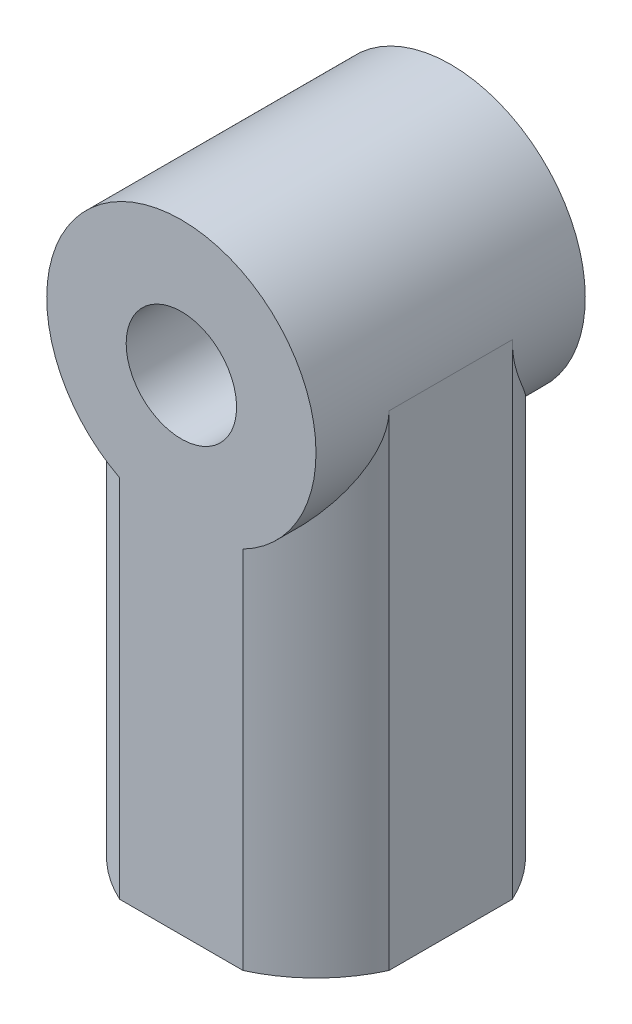
ISO-10303-21;
HEADER;
FILE_DESCRIPTION(('STEP AP214'),'2;1');
FILE_NAME('part.step','',(''),(''),'','','');
FILE_SCHEMA(('AUTOMOTIVE_DESIGN { 1 0 10303 214 1 1 1 1 }'));
ENDSEC;
DATA;
#1=APPLICATION_CONTEXT('core data for automotive mechanical design processes');
#2=APPLICATION_PROTOCOL_DEFINITION('international standard','automotive_design',2000,#1);
#3=PRODUCT_CONTEXT('',#1,'mechanical');
#4=PRODUCT('Part','Part','',(#3));
#5=PRODUCT_RELATED_PRODUCT_CATEGORY('part','',(#4));
#6=PRODUCT_DEFINITION_FORMATION('','',#4);
#7=PRODUCT_DEFINITION_CONTEXT('part definition',#1,'design');
#8=PRODUCT_DEFINITION('design','',#6,#7);
#9=PRODUCT_DEFINITION_SHAPE('','',#8);
#10=(LENGTH_UNIT() NAMED_UNIT(*) SI_UNIT(.MILLI.,.METRE.));
#11=(NAMED_UNIT(*) PLANE_ANGLE_UNIT() SI_UNIT($,.RADIAN.));
#12=(NAMED_UNIT(*) SI_UNIT($,.STERADIAN.) SOLID_ANGLE_UNIT());
#13=UNCERTAINTY_MEASURE_WITH_UNIT(LENGTH_MEASURE(1.E-05),#10,'distance_accuracy_value','');
#14=(GEOMETRIC_REPRESENTATION_CONTEXT(3) GLOBAL_UNCERTAINTY_ASSIGNED_CONTEXT((#13)) GLOBAL_UNIT_ASSIGNED_CONTEXT((#10,
#11,#12)) REPRESENTATION_CONTEXT('',''));
#15=CARTESIAN_POINT('',(0.,0.,0.));
#16=DIRECTION('',(0.,0.,1.));
#17=DIRECTION('',(1.,0.,0.));
#18=AXIS2_PLACEMENT_3D('',#15,#16,#17);
#19=CARTESIAN_POINT('',(504.503250066981,1441.12112005397,-8.0400000000008));
#20=DIRECTION('',(0.,-1.,0.));
#21=DIRECTION('',(0.,0.,1.));
#22=AXIS2_PLACEMENT_3D('',#19,#20,#21);
#23=PLANE('',#22);
#24=CARTESIAN_POINT('',(501.402450066981,1441.12112005397,-5.0000000000008));
#25=DIRECTION('',(0.,1.,0.));
#26=DIRECTION('',(0.,0.,1.));
#27=AXIS2_PLACEMENT_3D('',#24,#25,#26);
#28=CIRCLE('',#27,3.03999999999997);
#29=CARTESIAN_POINT('',(501.402450066981,1441.12112005397,-1.96000000000083));
#30=VERTEX_POINT('',#29);
#31=EDGE_CURVE('E19',#30,#30,#28,.T.);
#32=ORIENTED_EDGE('',*,*,#31,.F.);
#33=EDGE_LOOP('',(#32));
#34=FACE_BOUND('',#33,.T.);
#35=ADVANCED_FACE('F15',(#34),#23,.T.);
#36=CARTESIAN_POINT('',(501.402450066981,1428.12112005397,-5.0000000000008));
#37=DIRECTION('',(0.,1.,0.));
#38=DIRECTION('',(0.,0.,1.));
#39=AXIS2_PLACEMENT_3D('',#36,#37,#38);
#40=CYLINDRICAL_SURFACE('',#39,3.03999999999997);
#41=ORIENTED_EDGE('',*,*,#31,.T.);
#42=EDGE_LOOP('',(#41));
#43=FACE_BOUND('',#42,.T.);
#44=CARTESIAN_POINT('',(501.402450066981,1428.12112005397,-5.0000000000008));
#45=DIRECTION('',(0.,1.,0.));
#46=DIRECTION('',(0.,0.,1.));
#47=AXIS2_PLACEMENT_3D('',#44,#45,#46);
#48=CIRCLE('',#47,3.03999999999997);
#49=CARTESIAN_POINT('',(501.402450066981,1428.12112005397,-1.96000000000083));
#50=VERTEX_POINT('',#49);
#51=EDGE_CURVE('E129',#50,#50,#48,.T.);
#52=ORIENTED_EDGE('',*,*,#51,.F.);
#53=EDGE_LOOP('',(#52));
#54=FACE_BOUND('',#53,.T.);
#55=ADVANCED_FACE('F223',(#43,#54),#40,.F.);
#56=CARTESIAN_POINT('',(496.402450066981,1428.12112005397,-2.70871215252209));
#57=DIRECTION('',(-1.,0.,0.));
#58=DIRECTION('',(0.,1.,0.));
#59=AXIS2_PLACEMENT_3D('',#56,#57,#58);
#60=PLANE('',#59);
#61=DIRECTION('',(0.,1.,0.));
#62=VECTOR('',#61,1.);
#63=CARTESIAN_POINT('',(496.402450066981,1437.12112005397,-7.29128784747792));
#64=LINE('',#63,#62);
#65=CARTESIAN_POINT('',(496.402450066981,1428.12112005397,-7.29128784747799));
#66=VERTEX_POINT('',#65);
#67=CARTESIAN_POINT('',(496.402450066981,1446.12112005397,-7.29128784747792));
#68=VERTEX_POINT('',#67);
#69=EDGE_CURVE('E134',#66,#68,#64,.T.);
#70=ORIENTED_EDGE('',*,*,#69,.F.);
#71=DIRECTION('',(0.,0.,-1.));
#72=VECTOR('',#71,1.);
#73=CARTESIAN_POINT('',(496.402450066981,1428.12112005397,-4.99999999999998));
#74=LINE('',#73,#72);
#75=CARTESIAN_POINT('',(496.402450066981,1428.12112005397,-2.7087121525221));
#76=VERTEX_POINT('',#75);
#77=EDGE_CURVE('E89',#76,#66,#74,.T.);
#78=ORIENTED_EDGE('',*,*,#77,.F.);
#79=DIRECTION('',(0.,-1.,0.));
#80=VECTOR('',#79,1.);
#81=CARTESIAN_POINT('',(496.402450066981,1437.12112005397,-2.70871215252217));
#82=LINE('',#81,#80);
#83=CARTESIAN_POINT('',(496.402450066982,1446.12112005397,-2.70871215252033));
#84=VERTEX_POINT('',#83);
#85=EDGE_CURVE('E85',#84,#76,#82,.T.);
#86=ORIENTED_EDGE('',*,*,#85,.F.);
#87=DIRECTION('',(0.,0.,1.));
#88=VECTOR('',#87,1.);
#89=CARTESIAN_POINT('',(496.402450066981,1446.12112005397,-4.99999999999999));
#90=LINE('',#89,#88);
#91=EDGE_CURVE('E119',#68,#84,#90,.T.);
#92=ORIENTED_EDGE('',*,*,#91,.F.);
#93=EDGE_LOOP('',(#70,#78,#86,#92));
#94=FACE_BOUND('',#93,.T.);
#95=ADVANCED_FACE('F225',(#94),#60,.T.);
#96=CARTESIAN_POINT('',(506.402450066981,1446.12112005397,-2.70871215252208));
#97=DIRECTION('',(1.,0.,0.));
#98=DIRECTION('',(0.,-1.,0.));
#99=AXIS2_PLACEMENT_3D('',#96,#97,#98);
#100=PLANE('',#99);
#101=DIRECTION('',(0.,-1.,0.));
#102=VECTOR('',#101,1.);
#103=CARTESIAN_POINT('',(506.402450066981,1437.12112005397,-7.29128784747785));
#104=LINE('',#103,#102);
#105=CARTESIAN_POINT('',(506.40245006698,1446.12112005397,-7.29128784747471));
#106=VERTEX_POINT('',#105);
#107=CARTESIAN_POINT('',(506.402450066981,1428.12112005397,-7.29128784747787));
#108=VERTEX_POINT('',#107);
#109=EDGE_CURVE('E136',#106,#108,#104,.T.);
#110=ORIENTED_EDGE('',*,*,#109,.F.);
#111=DIRECTION('',(0.,0.,-1.));
#112=VECTOR('',#111,1.);
#113=CARTESIAN_POINT('',(506.402450066981,1446.12112005397,-4.99999999999999));
#114=LINE('',#113,#112);
#115=CARTESIAN_POINT('',(506.402450066981,1446.12112005397,-2.7087121525221));
#116=VERTEX_POINT('',#115);
#117=EDGE_CURVE('E116',#116,#106,#114,.T.);
#118=ORIENTED_EDGE('',*,*,#117,.F.);
#119=DIRECTION('',(0.,1.,0.));
#120=VECTOR('',#119,1.);
#121=CARTESIAN_POINT('',(506.402450066981,1437.12112005397,-2.70871215252208));
#122=LINE('',#121,#120);
#123=CARTESIAN_POINT('',(506.402450066981,1428.12112005397,-2.70871215252208));
#124=VERTEX_POINT('',#123);
#125=EDGE_CURVE('E124',#124,#116,#122,.T.);
#126=ORIENTED_EDGE('',*,*,#125,.F.);
#127=DIRECTION('',(0.,0.,1.));
#128=VECTOR('',#127,1.);
#129=CARTESIAN_POINT('',(506.402450066981,1428.12112005397,-4.99999999999998));
#130=LINE('',#129,#128);
#131=EDGE_CURVE('E127',#108,#124,#130,.T.);
#132=ORIENTED_EDGE('',*,*,#131,.F.);
#133=EDGE_LOOP('',(#110,#118,#126,#132));
#134=FACE_BOUND('',#133,.T.);
#135=ADVANCED_FACE('F216',(#134),#100,.T.);
#136=CARTESIAN_POINT('',(501.402450066982,1428.12112005397,-5.00000000000084));
#137=DIRECTION('',(-2.20657532238266E-13,1.,2.20657532238263E-13));
#138=DIRECTION('',(-1.,-2.20657532238266E-13,0.));
#139=AXIS2_PLACEMENT_3D('',#136,#137,#138);
#140=CYLINDRICAL_SURFACE('',#139,5.49999999999883);
#141=CARTESIAN_POINT('',(501.402450066982,1428.12112005397,-5.00000000000084));
#142=DIRECTION('',(-2.20657532238266E-13,1.,2.20657532238263E-13));
#143=DIRECTION('',(-1.,-2.20657532238266E-13,0.));
#144=AXIS2_PLACEMENT_3D('',#141,#142,#143);
#145=CIRCLE('',#144,5.49999999999883);
#146=CARTESIAN_POINT('',(503.693737914459,1428.12112005397,-10.));
#147=VERTEX_POINT('',#146);
#148=EDGE_CURVE('E130',#147,#108,#145,.F.);
#149=ORIENTED_EDGE('',*,*,#148,.F.);
#150=DIRECTION('',(0.,-1.,0.));
#151=VECTOR('',#150,1.);
#152=CARTESIAN_POINT('',(503.693737914459,1439.73612005397,-10.));
#153=LINE('',#152,#151);
#154=CARTESIAN_POINT('',(503.693737914459,1441.67702284531,-9.99999999999793));
#155=VERTEX_POINT('',#154);
#156=EDGE_CURVE('E113',#155,#147,#153,.T.);
#157=ORIENTED_EDGE('',*,*,#156,.F.);
#158=CARTESIAN_POINT('',(506.402450066978,1446.12112005397,-7.29128784747158));
#159=CARTESIAN_POINT('',(506.402468697578,1446.04737239063,-7.29121077630141));
#160=CARTESIAN_POINT('',(506.400819352999,1445.97367956106,-7.29484672692674));
#161=CARTESIAN_POINT('',(506.394340152049,1445.82729188328,-7.30892536257604));
#162=CARTESIAN_POINT('',(506.389519386904,1445.75459478697,-7.31934859025803));
#163=CARTESIAN_POINT('',(506.376958266668,1445.61187469429,-7.34616037488763));
#164=CARTESIAN_POINT('',(506.369268640232,1445.54182726788,-7.36244511880793));
#165=CARTESIAN_POINT('',(506.35116888539,1445.40344783088,-7.40012963012893));
#166=CARTESIAN_POINT('',(506.340756622325,1445.33511721263,-7.42153340993396));
#167=CARTESIAN_POINT('',(506.311480748449,1445.16609952037,-7.48051930944862));
#168=CARTESIAN_POINT('',(506.291012210973,1445.06663212876,-7.52079300825254));
#169=CARTESIAN_POINT('',(506.244944432601,1444.87201530233,-7.60819706869861));
#170=CARTESIAN_POINT('',(506.219342144332,1444.77686847351,-7.65533149826345));
#171=CARTESIAN_POINT('',(506.163186312313,1444.58977841845,-7.75475499860199));
#172=CARTESIAN_POINT('',(506.132593742133,1444.49786801476,-7.80708331084508));
#173=CARTESIAN_POINT('',(506.066856845711,1444.31765037017,-7.9150161111502));
#174=CARTESIAN_POINT('',(506.031710594477,1444.22934467398,-7.97062197929396));
#175=CARTESIAN_POINT('',(505.915150783507,1443.95878173141,-8.14740291832456));
#176=CARTESIAN_POINT('',(505.826035700066,1443.78216666815,-8.27220825085747));
#177=CARTESIAN_POINT('',(505.62866289902,1443.44200738349,-8.52345111060953));
#178=CARTESIAN_POINT('',(505.520443910038,1443.27843767177,-8.64988486471745));
#179=CARTESIAN_POINT('',(505.318842710787,1443.00964889779,-8.86351187812014));
#180=CARTESIAN_POINT('',(505.230327625619,1442.9013167739,-8.95140292736488));
#181=CARTESIAN_POINT('',(505.04324716819,1442.69119410428,-9.12441893969478));
#182=CARTESIAN_POINT('',(504.944678519678,1442.58940570875,-9.20954298907783));
#183=CARTESIAN_POINT('',(504.737542095672,1442.39318819134,-9.37547087406574));
#184=CARTESIAN_POINT('',(504.628992059144,1442.29874654401,-9.45628198548392));
#185=CARTESIAN_POINT('',(504.401680658591,1442.11791015131,-9.61233178650431));
#186=CARTESIAN_POINT('',(504.2829234471,1442.0315121631,-9.68757271922405));
#187=CARTESIAN_POINT('',(504.085115624638,1441.90079130264,-9.80214768448397));
#188=CARTESIAN_POINT('',(504.009307250794,1441.85352270776,-9.84375147750137));
#189=CARTESIAN_POINT('',(503.854160326853,1441.76254238298,-9.92409861459814));
#190=CARTESIAN_POINT('',(503.774822723517,1441.71882970796,-9.96284271849717));
#191=CARTESIAN_POINT('',(503.693737914458,1441.67702284531,-9.99999999999586));
#192=B_SPLINE_CURVE_WITH_KNOTS('',3,(#158,#159,#160,#161,#162,#163,#164,#165,#166,#167,#168,
#169,#170,#171,#172,#173,#174,#175,#176,#177,#178,#179,#180,#181,#182,#183,#184,#185,#186,#187,
#188,#189,#190,#191),.UNSPECIFIED.,.F.,.F.,(4,2,2,2,2,2,2,2,2,2,2,2,2,2,2,2,4),(0.,
0.221047456300763,0.441464000877186,0.658154738830127,0.875015883262775,1.20217741665796,
1.52953372966638,1.85958503171686,2.18977631540538,2.89009080085787,3.58900153658855,
4.08423143431468,4.57962323605405,5.07415104144705,5.56847860423153,5.86397442257535,
6.15939144289103),.UNSPECIFIED.);
#193=EDGE_CURVE('E125',#106,#155,#192,.T.);
#194=ORIENTED_EDGE('',*,*,#193,.F.);
#195=ORIENTED_EDGE('',*,*,#109,.T.);
#196=EDGE_LOOP('',(#149,#157,#194,#195));
#197=FACE_BOUND('',#196,.T.);
#198=ADVANCED_FACE('F180',(#197),#140,.T.);
#199=CARTESIAN_POINT('',(501.40245006698,1428.12112005397,-5.00000000000051));
#200=DIRECTION('',(2.20657532238293E-13,1.,2.2065753223829E-13));
#201=DIRECTION('',(-1.,2.20657532238293E-13,0.));
#202=AXIS2_PLACEMENT_3D('',#199,#200,#201);
#203=CYLINDRICAL_SURFACE('',#202,5.4999999999992);
#204=ORIENTED_EDGE('',*,*,#69,.T.);
#205=CARTESIAN_POINT('',(499.111162219503,1441.67702284531,-9.99999999999573));
#206=CARTESIAN_POINT('',(498.974468190255,1441.74750945246,-9.93736607777522));
#207=CARTESIAN_POINT('',(498.842783217536,1441.82337477373,-9.87023359335496));
#208=CARTESIAN_POINT('',(498.589762153638,1441.98454234416,-9.72861031659635));
#209=CARTESIAN_POINT('',(498.468414477741,1442.06983377667,-9.6541279686793));
#210=CARTESIAN_POINT('',(498.237255671421,1442.24779936122,-9.50007299344089));
#211=CARTESIAN_POINT('',(498.12734079163,1442.34039063878,-9.42055909232237));
#212=CARTESIAN_POINT('',(497.917589858555,1442.5328052584,-9.25716022691396));
#213=CARTESIAN_POINT('',(497.817752761025,1442.63262784933,-9.17327571686899));
#214=CARTESIAN_POINT('',(497.665963082926,1442.79760799686,-9.03664887659868));
#215=CARTESIAN_POINT('',(497.610826626502,1442.86066561165,-8.98486669258668));
#216=CARTESIAN_POINT('',(497.50402425365,1442.98914596866,-8.88044591925046));
#217=CARTESIAN_POINT('',(497.452362458194,1443.05457138249,-8.82780640188902));
#218=CARTESIAN_POINT('',(497.320677889379,1443.2301476852,-8.6882681178072));
#219=CARTESIAN_POINT('',(497.243601241013,1443.3421902223,-8.6009488937272));
#220=CARTESIAN_POINT('',(497.098702263217,1443.57234322171,-8.42645875660542));
#221=CARTESIAN_POINT('',(497.030885819876,1443.69045747838,-8.33928797235541));
#222=CARTESIAN_POINT('',(496.904449416125,1443.93325271203,-8.1669258659109));
#223=CARTESIAN_POINT('',(496.845844365261,1444.05794390758,-8.08173793918609));
#224=CARTESIAN_POINT('',(496.738212640452,1444.31440576127,-7.91626606516775));
#225=CARTESIAN_POINT('',(496.689177738745,1444.44617021291,-7.83597794653973));
#226=CARTESIAN_POINT('',(496.600911030214,1444.71899889171,-7.68383769455685));
#227=CARTESIAN_POINT('',(496.561746775976,1444.86011927508,-7.6120453870023));
#228=CARTESIAN_POINT('',(496.49516410914,1445.15126723172,-7.48468942177348));
#229=CARTESIAN_POINT('',(496.467661853702,1445.30122208031,-7.42901086908798));
#230=CARTESIAN_POINT('',(496.432561751696,1445.56271406802,-7.35612909572468));
#231=CARTESIAN_POINT('',(496.42144331092,1445.67187649561,-7.33235876027965));
#232=CARTESIAN_POINT('',(496.410138426183,1445.83831691159,-7.30800819989283));
#233=CARTESIAN_POINT('',(496.407264855342,1445.89460968377,-7.30177275851153));
#234=CARTESIAN_POINT('',(496.40341687583,1446.00763255661,-7.29339845561816));
#235=CARTESIAN_POINT('',(496.40244485943,1446.06436311812,-7.29126475440413));
#236=CARTESIAN_POINT('',(496.402450066983,1446.12112005397,-7.291287847469));
#237=B_SPLINE_CURVE_WITH_KNOTS('',3,(#205,#206,#207,#208,#209,#210,#211,#212,#213,#214,#215,
#216,#217,#218,#219,#220,#221,#222,#223,#224,#225,#226,#227,#228,#229,#230,#231,#232,#233,#234,
#235,#236),.UNSPECIFIED.,.F.,.F.,(4,2,2,2,2,2,2,2,2,2,2,2,2,2,2,4),(0.,0.497757796408778,
0.994950222848642,1.48714239439911,1.9792835132156,2.27462982671487,2.57032046158763,
3.05475461756806,3.53949527632509,4.02501263040184,4.51011071298042,4.9984436776764,
5.48320371496026,5.81881909041372,5.98878110264245,6.15895680030446),.UNSPECIFIED.);
#238=CARTESIAN_POINT('',(499.111162219503,1441.67702284531,-9.99999999999787));
#239=VERTEX_POINT('',#238);
#240=EDGE_CURVE('E123',#239,#68,#237,.T.);
#241=ORIENTED_EDGE('',*,*,#240,.F.);
#242=DIRECTION('',(0.,1.,0.));
#243=VECTOR('',#242,1.);
#244=CARTESIAN_POINT('',(499.111162219503,1439.73612005397,-10.));
#245=LINE('',#244,#243);
#246=CARTESIAN_POINT('',(499.111162219503,1428.12112005397,-10.));
#247=VERTEX_POINT('',#246);
#248=EDGE_CURVE('E106',#247,#239,#245,.T.);
#249=ORIENTED_EDGE('',*,*,#248,.F.);
#250=CARTESIAN_POINT('',(501.40245006698,1428.12112005397,-5.00000000000051));
#251=DIRECTION('',(2.20657532238293E-13,1.,2.2065753223829E-13));
#252=DIRECTION('',(-1.,2.20657532238293E-13,0.));
#253=AXIS2_PLACEMENT_3D('',#250,#251,#252);
#254=CIRCLE('',#253,5.4999999999992);
#255=EDGE_CURVE('E132',#66,#247,#254,.F.);
#256=ORIENTED_EDGE('',*,*,#255,.F.);
#257=EDGE_LOOP('',(#204,#241,#249,#256));
#258=FACE_BOUND('',#257,.T.);
#259=ADVANCED_FACE('F177',(#258),#203,.T.);
#260=CARTESIAN_POINT('',(501.40245006698,1428.12112005397,-4.99999999999965));
#261=DIRECTION('',(0.,1.,0.));
#262=DIRECTION('',(0.,0.,1.));
#263=AXIS2_PLACEMENT_3D('',#260,#261,#262);
#264=CYLINDRICAL_SURFACE('',#263,5.49999999999943);
#265=CARTESIAN_POINT('',(501.40245006698,1428.12112005397,-4.99999999999965));
#266=DIRECTION('',(0.,1.,0.));
#267=DIRECTION('',(0.,0.,1.));
#268=AXIS2_PLACEMENT_3D('',#265,#266,#267);
#269=CIRCLE('',#268,5.49999999999943);
#270=CARTESIAN_POINT('',(499.111162219503,1428.12112005397,0.));
#271=VERTEX_POINT('',#270);
#272=EDGE_CURVE('E78',#271,#76,#269,.F.);
#273=ORIENTED_EDGE('',*,*,#272,.F.);
#274=DIRECTION('',(0.,-1.,0.));
#275=VECTOR('',#274,1.);
#276=CARTESIAN_POINT('',(499.111162219503,1439.73612005397,0.));
#277=LINE('',#276,#275);
#278=CARTESIAN_POINT('',(499.111162219502,1441.67702284531,-2.66675482783348E-13));
#279=VERTEX_POINT('',#278);
#280=EDGE_CURVE('E82',#279,#271,#277,.T.);
#281=ORIENTED_EDGE('',*,*,#280,.F.);
#282=CARTESIAN_POINT('',(496.402450066983,1446.12112005397,-2.70871215251849));
#283=CARTESIAN_POINT('',(496.402431436383,1446.04737239063,-2.70878922368871));
#284=CARTESIAN_POINT('',(496.404080780962,1445.97367956106,-2.70515327306344));
#285=CARTESIAN_POINT('',(496.410559981911,1445.82729188328,-2.69107463741426));
#286=CARTESIAN_POINT('',(496.415380747056,1445.75459478697,-2.68065140973232));
#287=CARTESIAN_POINT('',(496.427941867293,1445.61187469429,-2.65383962510286));
#288=CARTESIAN_POINT('',(496.435631493729,1445.54182726788,-2.63755488118262));
#289=CARTESIAN_POINT('',(496.453731248571,1445.40344783088,-2.59987036986173));
#290=CARTESIAN_POINT('',(496.464143511636,1445.33511721262,-2.57846659005674));
#291=CARTESIAN_POINT('',(496.493419385512,1445.16609952037,-2.51948069054219));
#292=CARTESIAN_POINT('',(496.513887922988,1445.06663212876,-2.47920699173838));
#293=CARTESIAN_POINT('',(496.55995570136,1444.87201530233,-2.39180293129253));
#294=CARTESIAN_POINT('',(496.585557989629,1444.77686847351,-2.34466850172784));
#295=CARTESIAN_POINT('',(496.641713821648,1444.58977841845,-2.24524500138958));
#296=CARTESIAN_POINT('',(496.672306391828,1444.49786801475,-2.19291668914662));
#297=CARTESIAN_POINT('',(496.73804328825,1444.31765037017,-2.0849838888417));
#298=CARTESIAN_POINT('',(496.773189539484,1444.22934467398,-2.02937802069802));
#299=CARTESIAN_POINT('',(496.889749350454,1443.95878173141,-1.85259708166814));
#300=CARTESIAN_POINT('',(496.978864433895,1443.78216666815,-1.72779174913584));
#301=CARTESIAN_POINT('',(497.17623723494,1443.44200738349,-1.47654888938508));
#302=CARTESIAN_POINT('',(497.284456223922,1443.27843767177,-1.35011513527784));
#303=CARTESIAN_POINT('',(497.486057423173,1443.00964889779,-1.13648812187593));
#304=CARTESIAN_POINT('',(497.57457250834,1442.9013167739,-1.04859707263127));
#305=CARTESIAN_POINT('',(497.76165296577,1442.69119410428,-0.87558106030155));
#306=CARTESIAN_POINT('',(497.860221614281,1442.58940570875,-0.790457010918578));
#307=CARTESIAN_POINT('',(498.067358038287,1442.39318819134,-0.62452912593084));
#308=CARTESIAN_POINT('',(498.175908074815,1442.29874654401,-0.543718014512741));
#309=CARTESIAN_POINT('',(498.403219475368,1442.11791015131,-0.387668213492474));
#310=CARTESIAN_POINT('',(498.521976686859,1442.0315121631,-0.31242728077278));
#311=CARTESIAN_POINT('',(498.719784509321,1441.90079130264,-0.197852315512842));
#312=CARTESIAN_POINT('',(498.795592883166,1441.85352270776,-0.156248522495378));
#313=CARTESIAN_POINT('',(498.950739807107,1441.76254238298,-0.0759013853984586));
#314=CARTESIAN_POINT('',(499.030077410443,1441.71882970796,-0.0371572814993422));
#315=CARTESIAN_POINT('',(499.111162219502,1441.67702284531,-5.49631685798588E-13));
#316=B_SPLINE_CURVE_WITH_KNOTS('',3,(#282,#283,#284,#285,#286,#287,#288,#289,#290,#291,#292,
#293,#294,#295,#296,#297,#298,#299,#300,#301,#302,#303,#304,#305,#306,#307,#308,#309,#310,#311,
#312,#313,#314,#315),.UNSPECIFIED.,.F.,.F.,(4,2,2,2,2,2,2,2,2,2,2,2,2,2,2,2,4),(0.,
0.221047456300975,0.441464000877596,0.65815473883072,0.875015883263771,1.20217741665907,
1.52953372966734,1.85958503171742,2.18977631540629,2.89009080085634,3.58900153658407,
4.0842314343104,4.57962323604951,5.07415104144246,5.56847860422678,5.86397442257134,
6.1593914428879),.UNSPECIFIED.);
#317=EDGE_CURVE('E122',#84,#279,#316,.T.);
#318=ORIENTED_EDGE('',*,*,#317,.F.);
#319=ORIENTED_EDGE('',*,*,#85,.T.);
#320=EDGE_LOOP('',(#273,#281,#318,#319));
#321=FACE_BOUND('',#320,.T.);
#322=ADVANCED_FACE('F80',(#321),#264,.T.);
#323=CARTESIAN_POINT('',(506.402450066981,1428.12112005397,0.));
#324=DIRECTION('',(0.,-1.,0.));
#325=DIRECTION('',(-1.,0.,0.));
#326=AXIS2_PLACEMENT_3D('',#323,#324,#325);
#327=PLANE('',#326);
#328=ORIENTED_EDGE('',*,*,#51,.T.);
#329=EDGE_LOOP('',(#328));
#330=FACE_BOUND('',#329,.T.);
#331=ORIENTED_EDGE('',*,*,#148,.T.);
#332=ORIENTED_EDGE('',*,*,#131,.T.);
#333=CARTESIAN_POINT('',(501.402450066982,1428.12112005397,-4.9999999999991));
#334=DIRECTION('',(0.,1.,0.));
#335=DIRECTION('',(0.,0.,1.));
#336=AXIS2_PLACEMENT_3D('',#333,#334,#335);
#337=CIRCLE('',#336,5.49999999999882);
#338=CARTESIAN_POINT('',(503.693737914459,1428.12112005397,0.));
#339=VERTEX_POINT('',#338);
#340=EDGE_CURVE('E95',#339,#124,#337,.T.);
#341=ORIENTED_EDGE('',*,*,#340,.F.);
#342=DIRECTION('',(1.,0.,0.));
#343=VECTOR('',#342,1.);
#344=CARTESIAN_POINT('',(501.40245006698,1428.12112005397,0.));
#345=LINE('',#344,#343);
#346=EDGE_CURVE('E91',#271,#339,#345,.T.);
#347=ORIENTED_EDGE('',*,*,#346,.F.);
#348=ORIENTED_EDGE('',*,*,#272,.T.);
#349=ORIENTED_EDGE('',*,*,#77,.T.);
#350=ORIENTED_EDGE('',*,*,#255,.T.);
#351=DIRECTION('',(-1.,0.,0.));
#352=VECTOR('',#351,1.);
#353=CARTESIAN_POINT('',(501.402450066981,1428.12112005397,-10.));
#354=LINE('',#353,#352);
#355=EDGE_CURVE('E112',#147,#247,#354,.T.);
#356=ORIENTED_EDGE('',*,*,#355,.F.);
#357=EDGE_LOOP('',(#331,#332,#341,#347,#348,#349,#350,#356));
#358=FACE_BOUND('',#357,.T.);
#359=ADVANCED_FACE('F93',(#330,#358),#327,.T.);
#360=CARTESIAN_POINT('',(501.402450066982,1428.12112005397,-4.9999999999991));
#361=DIRECTION('',(0.,1.,0.));
#362=DIRECTION('',(0.,0.,1.));
#363=AXIS2_PLACEMENT_3D('',#360,#361,#362);
#364=CYLINDRICAL_SURFACE('',#363,5.49999999999882);
#365=ORIENTED_EDGE('',*,*,#125,.T.);
#366=CARTESIAN_POINT('',(503.69373791446,1441.67702284531,-3.54547411338768E-13));
#367=CARTESIAN_POINT('',(503.830431943708,1441.74750945246,-0.0626339222207645));
#368=CARTESIAN_POINT('',(503.962116916427,1441.82337477373,-0.129766406640923));
#369=CARTESIAN_POINT('',(504.215137980325,1441.98454234417,-0.271389683399305));
#370=CARTESIAN_POINT('',(504.336485656222,1442.06983377667,-0.34587203131625));
#371=CARTESIAN_POINT('',(504.567644462542,1442.24779936123,-0.499927006554444));
#372=CARTESIAN_POINT('',(504.677559342333,1442.34039063878,-0.579440907672871));
#373=CARTESIAN_POINT('',(504.887310275408,1442.53280525841,-0.74283977308101));
#374=CARTESIAN_POINT('',(504.987147372938,1442.63262784933,-0.826724283125815));
#375=CARTESIAN_POINT('',(505.138937051037,1442.79760799686,-0.963351123395973));
#376=CARTESIAN_POINT('',(505.194073507461,1442.86066561165,-1.01513330740798));
#377=CARTESIAN_POINT('',(505.300875880313,1442.98914596866,-1.11955408074416));
#378=CARTESIAN_POINT('',(505.352537675769,1443.05457138249,-1.17219359810557));
#379=CARTESIAN_POINT('',(505.484222244584,1443.2301476852,-1.31173188218675));
#380=CARTESIAN_POINT('',(505.56129889295,1443.3421902223,-1.39905110626615));
#381=CARTESIAN_POINT('',(505.706197870744,1443.57234322172,-1.57354124338666));
#382=CARTESIAN_POINT('',(505.774014314086,1443.69045747838,-1.66071202763599));
#383=CARTESIAN_POINT('',(505.900450717835,1443.93325271203,-1.83307413407913));
#384=CARTESIAN_POINT('',(505.9590557687,1444.05794390758,-1.91826206080325));
#385=CARTESIAN_POINT('',(506.066687493508,1444.31440576127,-2.08373393482025));
#386=CARTESIAN_POINT('',(506.115722395215,1444.44617021291,-2.16402205344762));
#387=CARTESIAN_POINT('',(506.203989103746,1444.71899889171,-2.31616230542985));
#388=CARTESIAN_POINT('',(506.243153357984,1444.86011927508,-2.38795461298432));
#389=CARTESIAN_POINT('',(506.309736024821,1445.15126723172,-2.51531057821283));
#390=CARTESIAN_POINT('',(506.337238280259,1445.30122208031,-2.57098913089809));
#391=CARTESIAN_POINT('',(506.372338382265,1445.56271406802,-2.64387090426089));
#392=CARTESIAN_POINT('',(506.383456823041,1445.67187649561,-2.66764123970569));
#393=CARTESIAN_POINT('',(506.394761707778,1445.83831691159,-2.69199180009221));
#394=CARTESIAN_POINT('',(506.397635278618,1445.89460968377,-2.69822724147342));
#395=CARTESIAN_POINT('',(506.401483258131,1446.00763255661,-2.70660154436664));
#396=CARTESIAN_POINT('',(506.402455274531,1446.06436311812,-2.70873524558061));
#397=CARTESIAN_POINT('',(506.402450066978,1446.12112005397,-2.7087121525157));
#398=B_SPLINE_CURVE_WITH_KNOTS('',3,(#366,#367,#368,#369,#370,#371,#372,#373,#374,#375,#376,
#377,#378,#379,#380,#381,#382,#383,#384,#385,#386,#387,#388,#389,#390,#391,#392,#393,#394,#395,
#396,#397),.UNSPECIFIED.,.F.,.F.,(4,2,2,2,2,2,2,2,2,2,2,2,2,2,2,4),(0.,0.497757796408767,
0.994950222848601,1.48714239439895,1.97928351321548,2.27462982671534,2.57032046158842,
3.05475461756632,3.53949527632095,4.02501263039512,4.51011071297156,4.99844367766872,
5.48320371495341,5.81881909040674,5.98878110263521,6.15895680029699),.UNSPECIFIED.);
#399=CARTESIAN_POINT('',(503.693737914459,1441.67702284531,-1.74550821687971E-13));
#400=VERTEX_POINT('',#399);
#401=EDGE_CURVE('E34',#400,#116,#398,.T.);
#402=ORIENTED_EDGE('',*,*,#401,.F.);
#403=DIRECTION('',(0.,1.,0.));
#404=VECTOR('',#403,1.);
#405=CARTESIAN_POINT('',(503.693737914459,1439.73612005397,0.));
#406=LINE('',#405,#404);
#407=EDGE_CURVE('E98',#339,#400,#406,.T.);
#408=ORIENTED_EDGE('',*,*,#407,.F.);
#409=ORIENTED_EDGE('',*,*,#340,.T.);
#410=EDGE_LOOP('',(#365,#402,#408,#409));
#411=FACE_BOUND('',#410,.T.);
#412=ADVANCED_FACE('F154',(#411),#364,.T.);
#413=CARTESIAN_POINT('',(501.40245006698,1446.12112005396,-10.));
#414=DIRECTION('',(0.,0.,1.));
#415=DIRECTION('',(1.,0.,0.));
#416=AXIS2_PLACEMENT_3D('',#413,#414,#415);
#417=CYLINDRICAL_SURFACE('',#416,4.99999999999777);
#418=ORIENTED_EDGE('',*,*,#401,.T.);
#419=ORIENTED_EDGE('',*,*,#117,.T.);
#420=ORIENTED_EDGE('',*,*,#193,.T.);
#421=CARTESIAN_POINT('',(501.40245006698,1446.12112005396,-10.));
#422=DIRECTION('',(0.,0.,1.));
#423=DIRECTION('',(1.,0.,0.));
#424=AXIS2_PLACEMENT_3D('',#421,#422,#423);
#425=CIRCLE('',#424,4.99999999999777);
#426=EDGE_CURVE('E103',#239,#155,#425,.F.);
#427=ORIENTED_EDGE('',*,*,#426,.F.);
#428=ORIENTED_EDGE('',*,*,#240,.T.);
#429=ORIENTED_EDGE('',*,*,#91,.T.);
#430=ORIENTED_EDGE('',*,*,#317,.T.);
#431=CARTESIAN_POINT('',(501.40245006698,1446.12112005396,0.));
#432=DIRECTION('',(0.,0.,1.));
#433=DIRECTION('',(1.,0.,0.));
#434=AXIS2_PLACEMENT_3D('',#431,#432,#433);
#435=CIRCLE('',#434,4.99999999999777);
#436=EDGE_CURVE('E102',#400,#279,#435,.T.);
#437=ORIENTED_EDGE('',*,*,#436,.F.);
#438=EDGE_LOOP('',(#418,#419,#420,#427,#428,#429,#430,#437));
#439=FACE_BOUND('',#438,.T.);
#440=ADVANCED_FACE('F157',(#439),#417,.T.);
#441=CARTESIAN_POINT('',(507.188551778102,1428.12112005397,-10.));
#442=DIRECTION('',(0.,0.,-1.));
#443=DIRECTION('',(-1.,0.,0.));
#444=AXIS2_PLACEMENT_3D('',#441,#442,#443);
#445=PLANE('',#444);
#446=CARTESIAN_POINT('',(501.402450066981,1446.12112005397,-10.));
#447=DIRECTION('',(0.,0.,-1.));
#448=DIRECTION('',(-1.,0.,0.));
#449=AXIS2_PLACEMENT_3D('',#446,#447,#448);
#450=CIRCLE('',#449,2.04999999999984);
#451=CARTESIAN_POINT('',(499.352450066981,1446.12112005397,-10.));
#452=VERTEX_POINT('',#451);
#453=EDGE_CURVE('E25',#452,#452,#450,.T.);
#454=ORIENTED_EDGE('',*,*,#453,.F.);
#455=EDGE_LOOP('',(#454));
#456=FACE_BOUND('',#455,.T.);
#457=ORIENTED_EDGE('',*,*,#248,.T.);
#458=ORIENTED_EDGE('',*,*,#426,.T.);
#459=ORIENTED_EDGE('',*,*,#156,.T.);
#460=ORIENTED_EDGE('',*,*,#355,.T.);
#461=EDGE_LOOP('',(#457,#458,#459,#460));
#462=FACE_BOUND('',#461,.T.);
#463=ADVANCED_FACE('F161',(#456,#462),#445,.T.);
#464=CARTESIAN_POINT('',(495.616348355859,1428.12112005397,0.));
#465=DIRECTION('',(0.,0.,1.));
#466=DIRECTION('',(1.,0.,0.));
#467=AXIS2_PLACEMENT_3D('',#464,#465,#466);
#468=PLANE('',#467);
#469=CARTESIAN_POINT('',(501.402450066981,1446.12112005397,0.));
#470=DIRECTION('',(0.,0.,-1.));
#471=DIRECTION('',(-1.,0.,0.));
#472=AXIS2_PLACEMENT_3D('',#469,#470,#471);
#473=CIRCLE('',#472,2.04999999999984);
#474=CARTESIAN_POINT('',(499.352450066981,1446.12112005397,0.));
#475=VERTEX_POINT('',#474);
#476=EDGE_CURVE('E10',#475,#475,#473,.F.);
#477=ORIENTED_EDGE('',*,*,#476,.F.);
#478=EDGE_LOOP('',(#477));
#479=FACE_BOUND('',#478,.T.);
#480=ORIENTED_EDGE('',*,*,#407,.T.);
#481=ORIENTED_EDGE('',*,*,#436,.T.);
#482=ORIENTED_EDGE('',*,*,#280,.T.);
#483=ORIENTED_EDGE('',*,*,#346,.T.);
#484=EDGE_LOOP('',(#480,#481,#482,#483));
#485=FACE_BOUND('',#484,.T.);
#486=ADVANCED_FACE('F101',(#479,#485),#468,.T.);
#487=CARTESIAN_POINT('',(501.402450066981,1446.12112005397,0.));
#488=DIRECTION('',(0.,0.,-1.));
#489=DIRECTION('',(-1.,0.,0.));
#490=AXIS2_PLACEMENT_3D('',#487,#488,#489);
#491=CYLINDRICAL_SURFACE('',#490,2.04999999999984);
#492=ORIENTED_EDGE('',*,*,#476,.T.);
#493=EDGE_LOOP('',(#492));
#494=FACE_BOUND('',#493,.T.);
#495=ORIENTED_EDGE('',*,*,#453,.T.);
#496=EDGE_LOOP('',(#495));
#497=FACE_BOUND('',#496,.T.);
#498=ADVANCED_FACE('F17',(#494,#497),#491,.F.);
#499=CLOSED_SHELL('',(#35,#55,#95,#135,#198,#259,#322,#359,#412,#440,#463,#486,#498));
#500=MANIFOLD_SOLID_BREP('B1',#499);
#501=ADVANCED_BREP_SHAPE_REPRESENTATION('',(#18,#500),#14);
#502=SHAPE_DEFINITION_REPRESENTATION(#9,#501);
ENDSEC;
END-ISO-10303-21;
